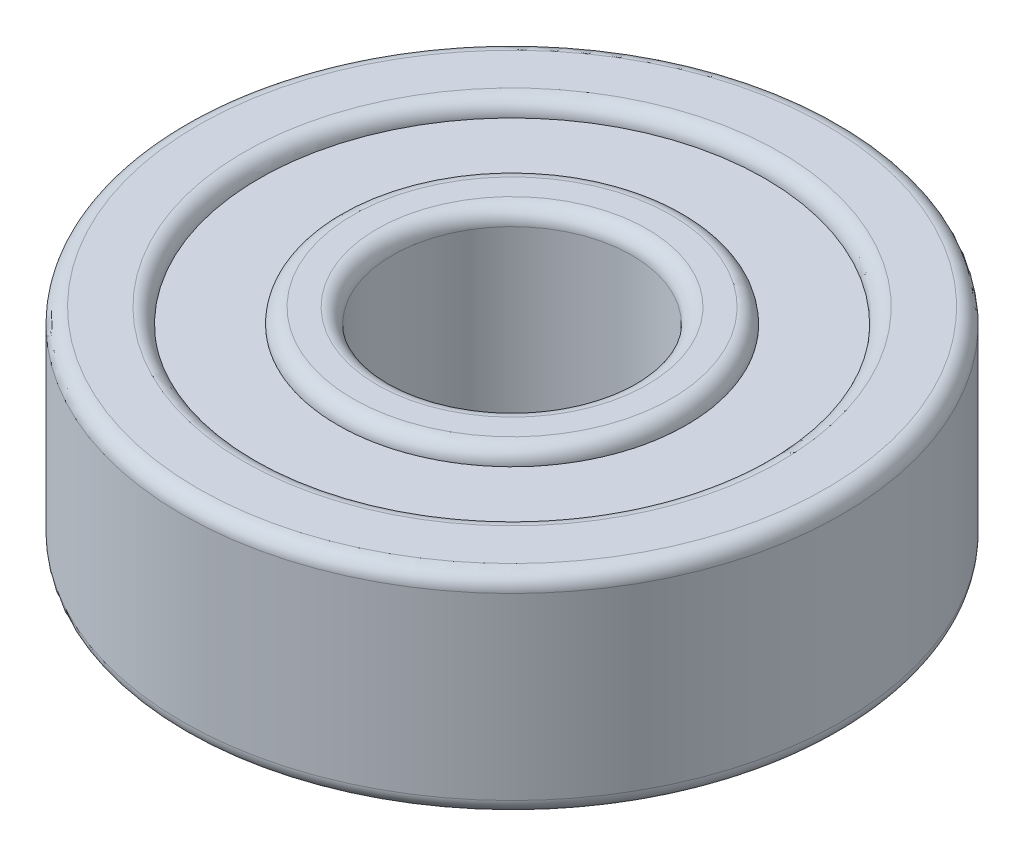
ISO-10303-21;
HEADER;
FILE_DESCRIPTION(('STEP AP214'),'2;1');
FILE_NAME('part.step','',(''),(''),'','','');
FILE_SCHEMA(('AUTOMOTIVE_DESIGN { 1 0 10303 214 1 1 1 1 }'));
ENDSEC;
DATA;
#1=APPLICATION_CONTEXT('core data for automotive mechanical design processes');
#2=APPLICATION_PROTOCOL_DEFINITION('international standard','automotive_design',2000,#1);
#3=PRODUCT_CONTEXT('',#1,'mechanical');
#4=PRODUCT('Part','Part','',(#3));
#5=PRODUCT_RELATED_PRODUCT_CATEGORY('part','',(#4));
#6=PRODUCT_DEFINITION_FORMATION('','',#4);
#7=PRODUCT_DEFINITION_CONTEXT('part definition',#1,'design');
#8=PRODUCT_DEFINITION('design','',#6,#7);
#9=PRODUCT_DEFINITION_SHAPE('','',#8);
#10=(LENGTH_UNIT() NAMED_UNIT(*) SI_UNIT(.MILLI.,.METRE.));
#11=(NAMED_UNIT(*) PLANE_ANGLE_UNIT() SI_UNIT($,.RADIAN.));
#12=(NAMED_UNIT(*) SI_UNIT($,.STERADIAN.) SOLID_ANGLE_UNIT());
#13=UNCERTAINTY_MEASURE_WITH_UNIT(LENGTH_MEASURE(1.E-05),#10,'distance_accuracy_value','');
#14=(GEOMETRIC_REPRESENTATION_CONTEXT(3) GLOBAL_UNCERTAINTY_ASSIGNED_CONTEXT((#13)) GLOBAL_UNIT_ASSIGNED_CONTEXT((#10,
#11,#12)) REPRESENTATION_CONTEXT('',''));
#15=CARTESIAN_POINT('',(0.,0.,0.));
#16=DIRECTION('',(0.,0.,1.));
#17=DIRECTION('',(1.,0.,0.));
#18=AXIS2_PLACEMENT_3D('',#15,#16,#17);
#19=CARTESIAN_POINT('',(0.,-26.8639331784423,0.));
#20=DIRECTION('',(0.,1.,0.));
#21=DIRECTION('',(0.,0.,-1.));
#22=AXIS2_PLACEMENT_3D('',#19,#20,#21);
#23=CYLINDRICAL_SURFACE('',#22,8.4400009);
#24=CARTESIAN_POINT('',(0.,-2.9920057,0.));
#25=DIRECTION('',(0.,-1.,0.));
#26=DIRECTION('',(0.,0.,-1.));
#27=AXIS2_PLACEMENT_3D('',#24,#25,#26);
#28=CIRCLE('',#27,8.4400009);
#29=CARTESIAN_POINT('',(0.,-2.9920057,-8.4400009));
#30=VERTEX_POINT('',#29);
#31=EDGE_CURVE('E49',#30,#30,#28,.F.);
#32=ORIENTED_EDGE('',*,*,#31,.T.);
#33=EDGE_LOOP('',(#32));
#34=FACE_BOUND('',#33,.T.);
#35=CARTESIAN_POINT('',(0.,-2.01495041180427,0.));
#36=DIRECTION('',(0.,-1.,0.));
#37=DIRECTION('',(0.,0.,-1.));
#38=AXIS2_PLACEMENT_3D('',#35,#36,#37);
#39=CIRCLE('',#38,8.4400009);
#40=CARTESIAN_POINT('',(0.,-2.01495041180427,-8.4400009));
#41=VERTEX_POINT('',#40);
#42=EDGE_CURVE('E53',#41,#41,#39,.T.);
#43=ORIENTED_EDGE('',*,*,#42,.T.);
#44=EDGE_LOOP('',(#43));
#45=FACE_BOUND('',#44,.T.);
#46=ADVANCED_FACE('F43',(#34,#45),#23,.T.);
#47=CARTESIAN_POINT('',(0.,-2.01495041180427,0.));
#48=DIRECTION('',(0.,1.,0.));
#49=DIRECTION('',(0.,0.,-1.));
#50=AXIS2_PLACEMENT_3D('',#47,#48,#49);
#51=PLANE('',#50);
#52=CARTESIAN_POINT('',(0.,-2.01495041180427,0.));
#53=DIRECTION('',(0.,-1.,0.));
#54=DIRECTION('',(0.,0.,-1.));
#55=AXIS2_PLACEMENT_3D('',#52,#53,#54);
#56=CIRCLE('',#55,5.8200036);
#57=CARTESIAN_POINT('',(0.,-2.01495041180427,-5.8200036));
#58=VERTEX_POINT('',#57);
#59=EDGE_CURVE('E58',#58,#58,#56,.T.);
#60=ORIENTED_EDGE('',*,*,#59,.T.);
#61=EDGE_LOOP('',(#60));
#62=FACE_BOUND('',#61,.T.);
#63=ORIENTED_EDGE('',*,*,#42,.F.);
#64=EDGE_LOOP('',(#63));
#65=FACE_BOUND('',#64,.T.);
#66=ADVANCED_FACE('F63',(#62,#65),#51,.T.);
#67=CARTESIAN_POINT('',(0.,-26.8639331784423,0.));
#68=DIRECTION('',(0.,1.,0.));
#69=DIRECTION('',(0.,0.,-1.));
#70=AXIS2_PLACEMENT_3D('',#67,#68,#69);
#71=CYLINDRICAL_SURFACE('',#70,5.8200036);
#72=CARTESIAN_POINT('',(0.,-2.9920057,0.));
#73=DIRECTION('',(0.,-1.,0.));
#74=DIRECTION('',(0.,0.,-1.));
#75=AXIS2_PLACEMENT_3D('',#72,#73,#74);
#76=CIRCLE('',#75,5.8200036);
#77=CARTESIAN_POINT('',(0.,-2.9920057,-5.8200036));
#78=VERTEX_POINT('',#77);
#79=EDGE_CURVE('E11',#78,#78,#76,.F.);
#80=ORIENTED_EDGE('',*,*,#79,.F.);
#81=EDGE_LOOP('',(#80));
#82=FACE_BOUND('',#81,.T.);
#83=ORIENTED_EDGE('',*,*,#59,.F.);
#84=EDGE_LOOP('',(#83));
#85=FACE_BOUND('',#84,.T.);
#86=ADVANCED_FACE('F66',(#82,#85),#71,.F.);
#87=CARTESIAN_POINT('',(0.,-2.9920057,0.));
#88=DIRECTION('',(0.,1.,0.));
#89=DIRECTION('',(0.,0.,-1.));
#90=AXIS2_PLACEMENT_3D('',#87,#88,#89);
#91=PLANE('',#90);
#92=ORIENTED_EDGE('',*,*,#31,.F.);
#93=EDGE_LOOP('',(#92));
#94=FACE_BOUND('',#93,.T.);
#95=ORIENTED_EDGE('',*,*,#79,.T.);
#96=EDGE_LOOP('',(#95));
#97=FACE_BOUND('',#96,.T.);
#98=ADVANCED_FACE('F68',(#94,#97),#91,.F.);
#99=CLOSED_SHELL('',(#46,#66,#86,#98));
#100=MANIFOLD_SOLID_BREP('B2',#99);
#101=CARTESIAN_POINT('',(0.,26.8639331784423,0.));
#102=DIRECTION('',(0.,-1.,0.));
#103=DIRECTION('',(0.,0.,-1.));
#104=AXIS2_PLACEMENT_3D('',#101,#102,#103);
#105=CYLINDRICAL_SURFACE('',#104,8.4400009);
#106=CARTESIAN_POINT('',(0.,2.9920057,0.));
#107=DIRECTION('',(0.,-1.,0.));
#108=DIRECTION('',(0.,0.,-1.));
#109=AXIS2_PLACEMENT_3D('',#106,#107,#108);
#110=CIRCLE('',#109,8.4400009);
#111=CARTESIAN_POINT('',(0.,2.9920057,-8.4400009));
#112=VERTEX_POINT('',#111);
#113=EDGE_CURVE('E137',#112,#112,#110,.F.);
#114=ORIENTED_EDGE('',*,*,#113,.F.);
#115=EDGE_LOOP('',(#114));
#116=FACE_BOUND('',#115,.T.);
#117=CARTESIAN_POINT('',(0.,2.01495041180427,0.));
#118=DIRECTION('',(0.,-1.,0.));
#119=DIRECTION('',(0.,0.,-1.));
#120=AXIS2_PLACEMENT_3D('',#117,#118,#119);
#121=CIRCLE('',#120,8.4400009);
#122=CARTESIAN_POINT('',(0.,2.01495041180427,-8.4400009));
#123=VERTEX_POINT('',#122);
#124=EDGE_CURVE('E141',#123,#123,#121,.T.);
#125=ORIENTED_EDGE('',*,*,#124,.F.);
#126=EDGE_LOOP('',(#125));
#127=FACE_BOUND('',#126,.T.);
#128=ADVANCED_FACE('F131',(#116,#127),#105,.T.);
#129=CARTESIAN_POINT('',(0.,2.01495041180427,0.));
#130=DIRECTION('',(0.,-1.,0.));
#131=DIRECTION('',(0.,0.,-1.));
#132=AXIS2_PLACEMENT_3D('',#129,#130,#131);
#133=PLANE('',#132);
#134=CARTESIAN_POINT('',(0.,2.01495041180427,0.));
#135=DIRECTION('',(0.,-1.,0.));
#136=DIRECTION('',(0.,0.,-1.));
#137=AXIS2_PLACEMENT_3D('',#134,#135,#136);
#138=CIRCLE('',#137,5.8200036);
#139=CARTESIAN_POINT('',(0.,2.01495041180427,-5.8200036));
#140=VERTEX_POINT('',#139);
#141=EDGE_CURVE('E146',#140,#140,#138,.T.);
#142=ORIENTED_EDGE('',*,*,#141,.F.);
#143=EDGE_LOOP('',(#142));
#144=FACE_BOUND('',#143,.T.);
#145=ORIENTED_EDGE('',*,*,#124,.T.);
#146=EDGE_LOOP('',(#145));
#147=FACE_BOUND('',#146,.T.);
#148=ADVANCED_FACE('F153',(#144,#147),#133,.T.);
#149=CARTESIAN_POINT('',(0.,26.8639331784423,0.));
#150=DIRECTION('',(0.,-1.,0.));
#151=DIRECTION('',(0.,0.,-1.));
#152=AXIS2_PLACEMENT_3D('',#149,#150,#151);
#153=CYLINDRICAL_SURFACE('',#152,5.8200036);
#154=CARTESIAN_POINT('',(0.,2.9920057,0.));
#155=DIRECTION('',(0.,-1.,0.));
#156=DIRECTION('',(0.,0.,-1.));
#157=AXIS2_PLACEMENT_3D('',#154,#155,#156);
#158=CIRCLE('',#157,5.8200036);
#159=CARTESIAN_POINT('',(0.,2.9920057,-5.8200036));
#160=VERTEX_POINT('',#159);
#161=EDGE_CURVE('E42',#160,#160,#158,.F.);
#162=ORIENTED_EDGE('',*,*,#161,.T.);
#163=EDGE_LOOP('',(#162));
#164=FACE_BOUND('',#163,.T.);
#165=ORIENTED_EDGE('',*,*,#141,.T.);
#166=EDGE_LOOP('',(#165));
#167=FACE_BOUND('',#166,.T.);
#168=ADVANCED_FACE('F151',(#164,#167),#153,.F.);
#169=CARTESIAN_POINT('',(0.,2.9920057,0.));
#170=DIRECTION('',(0.,-1.,0.));
#171=DIRECTION('',(0.,0.,-1.));
#172=AXIS2_PLACEMENT_3D('',#169,#170,#171);
#173=PLANE('',#172);
#174=ORIENTED_EDGE('',*,*,#113,.T.);
#175=EDGE_LOOP('',(#174));
#176=FACE_BOUND('',#175,.T.);
#177=ORIENTED_EDGE('',*,*,#161,.F.);
#178=EDGE_LOOP('',(#177));
#179=FACE_BOUND('',#178,.T.);
#180=ADVANCED_FACE('F172',(#176,#179),#173,.F.);
#181=CLOSED_SHELL('',(#128,#148,#168,#180));
#182=MANIFOLD_SOLID_BREP('B6',#181);
#183=CARTESIAN_POINT('',(5.68391542482456,0.,-4.53277129595592));
#184=DIRECTION('',(0.,1.,0.));
#185=DIRECTION('',(0.781831482468022,0.,-0.623489801858743));
#186=AXIS2_PLACEMENT_3D('',#183,#184,#185);
#187=SPHERICAL_SURFACE('',#186,2.3300055);
#188=CARTESIAN_POINT('',(5.68391542482456,2.3300055,-4.53277129595592));
#189=VERTEX_POINT('',#188);
#190=VERTEX_LOOP('',#189);
#191=FACE_BOUND('',#190,.T.);
#192=ADVANCED_FACE('F198',(#191),#187,.T.);
#193=CLOSED_SHELL('',(#192));
#194=MANIFOLD_SOLID_BREP('B37',#193);
#195=CARTESIAN_POINT('',(7.08772660401141,0.,1.61772734562699));
#196=DIRECTION('',(0.,1.,0.));
#197=DIRECTION('',(0.974927912181826,0.,0.222520933956305));
#198=AXIS2_PLACEMENT_3D('',#195,#196,#197);
#199=SPHERICAL_SURFACE('',#198,2.3300055);
#200=CARTESIAN_POINT('',(7.08772660401141,2.3300055,1.61772734562699));
#201=VERTEX_POINT('',#200);
#202=VERTEX_LOOP('',#201);
#203=FACE_BOUND('',#202,.T.);
#204=ADVANCED_FACE('F231',(#203),#199,.T.);
#205=CLOSED_SHELL('',(#204));
#206=MANIFOLD_SOLID_BREP('B127',#205);
#207=CARTESIAN_POINT('',(3.15433508710332,0.,6.55004430032877));
#208=DIRECTION('',(0.,1.,0.));
#209=DIRECTION('',(0.433883739117565,0.,0.900968867902416));
#210=AXIS2_PLACEMENT_3D('',#207,#208,#209);
#211=SPHERICAL_SURFACE('',#210,2.3300055);
#212=CARTESIAN_POINT('',(3.15433508710332,2.3300055,6.55004430032877));
#213=VERTEX_POINT('',#212);
#214=VERTEX_LOOP('',#213);
#215=FACE_BOUND('',#214,.T.);
#216=ADVANCED_FACE('F264',(#215),#211,.T.);
#217=CLOSED_SHELL('',(#216));
#218=MANIFOLD_SOLID_BREP('B194',#217);
#219=CARTESIAN_POINT('',(-3.15433508710322,0.,6.55004430032881));
#220=DIRECTION('',(0.,1.,0.));
#221=DIRECTION('',(-0.433883739117553,0.,0.900968867902422));
#222=AXIS2_PLACEMENT_3D('',#219,#220,#221);
#223=SPHERICAL_SURFACE('',#222,2.3300055);
#224=CARTESIAN_POINT('',(-3.15433508710322,2.3300055,6.55004430032881));
#225=VERTEX_POINT('',#224);
#226=VERTEX_LOOP('',#225);
#227=FACE_BOUND('',#226,.T.);
#228=ADVANCED_FACE('F297',(#227),#223,.T.);
#229=CLOSED_SHELL('',(#228));
#230=MANIFOLD_SOLID_BREP('B227',#229);
#231=CARTESIAN_POINT('',(-7.08772660401139,0.,1.61772734562709));
#232=DIRECTION('',(0.,1.,0.));
#233=DIRECTION('',(-0.974927912181823,0.,0.222520933956318));
#234=AXIS2_PLACEMENT_3D('',#231,#232,#233);
#235=SPHERICAL_SURFACE('',#234,2.3300055);
#236=CARTESIAN_POINT('',(-7.08772660401139,2.3300055,1.61772734562709));
#237=VERTEX_POINT('',#236);
#238=VERTEX_LOOP('',#237);
#239=FACE_BOUND('',#238,.T.);
#240=ADVANCED_FACE('F330',(#239),#235,.T.);
#241=CLOSED_SHELL('',(#240));
#242=MANIFOLD_SOLID_BREP('B260',#241);
#243=CARTESIAN_POINT('',(-5.68391542482462,0.,-4.53277129595584));
#244=DIRECTION('',(0.,1.,0.));
#245=DIRECTION('',(-0.781831482468031,0.,-0.623489801858732));
#246=AXIS2_PLACEMENT_3D('',#243,#244,#245);
#247=SPHERICAL_SURFACE('',#246,2.3300055);
#248=CARTESIAN_POINT('',(-5.68391542482462,2.3300055,-4.53277129595584));
#249=VERTEX_POINT('',#248);
#250=VERTEX_LOOP('',#249);
#251=FACE_BOUND('',#250,.T.);
#252=ADVANCED_FACE('F363',(#251),#247,.T.);
#253=CLOSED_SHELL('',(#252));
#254=MANIFOLD_SOLID_BREP('B293',#253);
#255=CARTESIAN_POINT('',(0.,0.,-7.2700007));
#256=DIRECTION('',(0.,1.,0.));
#257=DIRECTION('',(0.,0.,-1.));
#258=AXIS2_PLACEMENT_3D('',#255,#256,#257);
#259=SPHERICAL_SURFACE('',#258,2.3300055);
#260=CARTESIAN_POINT('',(0.,2.3300055,-7.2700007));
#261=VERTEX_POINT('',#260);
#262=VERTEX_LOOP('',#261);
#263=FACE_BOUND('',#262,.T.);
#264=ADVANCED_FACE('F398',(#263),#259,.T.);
#265=CLOSED_SHELL('',(#264));
#266=MANIFOLD_SOLID_BREP('B326',#265);
#267=CARTESIAN_POINT('',(0.,-3.5000057,0.));
#268=DIRECTION('',(0.,1.,0.));
#269=DIRECTION('',(0.,0.,1.));
#270=AXIS2_PLACEMENT_3D('',#267,#268,#269);
#271=CYLINDRICAL_SURFACE('',#270,8.4400009);
#272=CARTESIAN_POINT('',(0.,2.9920057,0.));
#273=DIRECTION('',(0.,1.,0.));
#274=DIRECTION('',(0.,0.,1.));
#275=AXIS2_PLACEMENT_3D('',#272,#273,#274);
#276=CIRCLE('',#275,8.4400009);
#277=CARTESIAN_POINT('',(0.,2.9920057,8.4400009));
#278=VERTEX_POINT('',#277);
#279=EDGE_CURVE('E437',#278,#278,#276,.T.);
#280=ORIENTED_EDGE('',*,*,#279,.T.);
#281=EDGE_LOOP('',(#280));
#282=FACE_BOUND('',#281,.T.);
#283=CARTESIAN_POINT('',(0.,2.01495041180427,0.));
#284=DIRECTION('',(0.,-1.,0.));
#285=DIRECTION('',(0.,0.,-1.));
#286=AXIS2_PLACEMENT_3D('',#283,#284,#285);
#287=CIRCLE('',#286,8.4400009);
#288=CARTESIAN_POINT('',(0.,2.01495041180427,-8.4400009));
#289=VERTEX_POINT('',#288);
#290=EDGE_CURVE('E449',#289,#289,#287,.F.);
#291=ORIENTED_EDGE('',*,*,#290,.F.);
#292=EDGE_LOOP('',(#291));
#293=FACE_BOUND('',#292,.T.);
#294=ADVANCED_FACE('F417',(#282,#293),#271,.F.);
#295=CARTESIAN_POINT('',(0.,-2.9920057,0.));
#296=DIRECTION('',(0.,1.,0.));
#297=DIRECTION('',(0.,0.,1.));
#298=AXIS2_PLACEMENT_3D('',#295,#296,#297);
#299=CIRCLE('',#298,8.4400009);
#300=CARTESIAN_POINT('',(0.,-2.9920057,8.4400009));
#301=VERTEX_POINT('',#300);
#302=EDGE_CURVE('E440',#301,#301,#299,.F.);
#303=ORIENTED_EDGE('',*,*,#302,.T.);
#304=EDGE_LOOP('',(#303));
#305=FACE_BOUND('',#304,.T.);
#306=CARTESIAN_POINT('',(0.,-2.01495041180427,0.));
#307=DIRECTION('',(0.,1.,0.));
#308=DIRECTION('',(0.,0.,1.));
#309=AXIS2_PLACEMENT_3D('',#306,#307,#308);
#310=CIRCLE('',#309,8.4400009);
#311=CARTESIAN_POINT('',(0.,-2.01495041180427,8.4400009));
#312=VERTEX_POINT('',#311);
#313=EDGE_CURVE('E452',#312,#312,#310,.F.);
#314=ORIENTED_EDGE('',*,*,#313,.F.);
#315=EDGE_LOOP('',(#314));
#316=FACE_BOUND('',#315,.T.);
#317=ADVANCED_FACE('F459',(#305,#316),#271,.F.);
#318=CARTESIAN_POINT('',(0.,3.5000057,0.));
#319=DIRECTION('',(0.,1.,0.));
#320=DIRECTION('',(0.,0.,1.));
#321=AXIS2_PLACEMENT_3D('',#318,#319,#320);
#322=PLANE('',#321);
#323=CARTESIAN_POINT('',(0.,3.5000057,0.));
#324=DIRECTION('',(0.,1.,0.));
#325=DIRECTION('',(0.,0.,1.));
#326=AXIS2_PLACEMENT_3D('',#323,#324,#325);
#327=CIRCLE('',#326,8.9480009);
#328=CARTESIAN_POINT('',(0.,3.5000057,8.9480009));
#329=VERTEX_POINT('',#328);
#330=EDGE_CURVE('E428',#329,#329,#327,.F.);
#331=ORIENTED_EDGE('',*,*,#330,.T.);
#332=EDGE_LOOP('',(#331));
#333=FACE_BOUND('',#332,.T.);
#334=CARTESIAN_POINT('',(0.,3.5000057,0.));
#335=DIRECTION('',(0.,1.,0.));
#336=DIRECTION('',(0.,0.,1.));
#337=AXIS2_PLACEMENT_3D('',#334,#335,#336);
#338=CIRCLE('',#337,10.4920034);
#339=CARTESIAN_POINT('',(0.,3.5000057,10.4920034));
#340=VERTEX_POINT('',#339);
#341=EDGE_CURVE('E432',#340,#340,#338,.T.);
#342=ORIENTED_EDGE('',*,*,#341,.T.);
#343=EDGE_LOOP('',(#342));
#344=FACE_BOUND('',#343,.T.);
#345=ADVANCED_FACE('F461',(#333,#344),#322,.T.);
#346=CARTESIAN_POINT('',(0.,-3.5000057,0.));
#347=DIRECTION('',(0.,1.,0.));
#348=DIRECTION('',(0.,0.,1.));
#349=AXIS2_PLACEMENT_3D('',#346,#347,#348);
#350=PLANE('',#349);
#351=CARTESIAN_POINT('',(0.,-3.5000057,0.));
#352=DIRECTION('',(0.,1.,0.));
#353=DIRECTION('',(0.,0.,1.));
#354=AXIS2_PLACEMENT_3D('',#351,#352,#353);
#355=CIRCLE('',#354,8.9480009);
#356=CARTESIAN_POINT('',(0.,-3.5000057,8.9480009));
#357=VERTEX_POINT('',#356);
#358=EDGE_CURVE('E443',#357,#357,#355,.T.);
#359=ORIENTED_EDGE('',*,*,#358,.T.);
#360=EDGE_LOOP('',(#359));
#361=FACE_BOUND('',#360,.T.);
#362=CARTESIAN_POINT('',(0.,-3.5000057,0.));
#363=DIRECTION('',(0.,1.,0.));
#364=DIRECTION('',(0.,0.,1.));
#365=AXIS2_PLACEMENT_3D('',#362,#363,#364);
#366=CIRCLE('',#365,10.4920034);
#367=CARTESIAN_POINT('',(0.,-3.5000057,10.4920034));
#368=VERTEX_POINT('',#367);
#369=EDGE_CURVE('E446',#368,#368,#366,.F.);
#370=ORIENTED_EDGE('',*,*,#369,.T.);
#371=EDGE_LOOP('',(#370));
#372=FACE_BOUND('',#371,.T.);
#373=ADVANCED_FACE('F468',(#361,#372),#350,.F.);
#374=CARTESIAN_POINT('',(0.,3.5000057,0.));
#375=DIRECTION('',(0.,-1.,0.));
#376=DIRECTION('',(0.,0.,-1.));
#377=AXIS2_PLACEMENT_3D('',#374,#375,#376);
#378=CYLINDRICAL_SURFACE('',#377,11.0000034);
#379=CARTESIAN_POINT('',(0.,-2.9920057,0.));
#380=DIRECTION('',(0.,1.,0.));
#381=DIRECTION('',(0.,0.,1.));
#382=AXIS2_PLACEMENT_3D('',#379,#380,#381);
#383=CIRCLE('',#382,11.0000034);
#384=CARTESIAN_POINT('',(0.,-2.9920057,11.0000034));
#385=VERTEX_POINT('',#384);
#386=EDGE_CURVE('E397',#385,#385,#383,.T.);
#387=ORIENTED_EDGE('',*,*,#386,.T.);
#388=EDGE_LOOP('',(#387));
#389=FACE_BOUND('',#388,.T.);
#390=CARTESIAN_POINT('',(0.,2.9920057,0.));
#391=DIRECTION('',(0.,1.,0.));
#392=DIRECTION('',(0.,0.,1.));
#393=AXIS2_PLACEMENT_3D('',#390,#391,#392);
#394=CIRCLE('',#393,11.0000034);
#395=CARTESIAN_POINT('',(0.,2.9920057,11.0000034));
#396=VERTEX_POINT('',#395);
#397=EDGE_CURVE('E424',#396,#396,#394,.F.);
#398=ORIENTED_EDGE('',*,*,#397,.T.);
#399=EDGE_LOOP('',(#398));
#400=FACE_BOUND('',#399,.T.);
#401=ADVANCED_FACE('F473',(#389,#400),#378,.T.);
#402=CARTESIAN_POINT('',(0.,0.,0.));
#403=DIRECTION('',(0.,1.,0.));
#404=DIRECTION('',(0.,0.,1.));
#405=AXIS2_PLACEMENT_3D('',#402,#403,#404);
#406=TOROIDAL_SURFACE('',#405,7.2700007,2.3300055);
#407=ORIENTED_EDGE('',*,*,#313,.T.);
#408=EDGE_LOOP('',(#407));
#409=FACE_BOUND('',#408,.T.);
#410=ORIENTED_EDGE('',*,*,#290,.T.);
#411=EDGE_LOOP('',(#410));
#412=FACE_BOUND('',#411,.T.);
#413=ADVANCED_FACE('F456',(#409,#412),#406,.F.);
#414=CARTESIAN_POINT('',(0.,-2.9920057,0.));
#415=DIRECTION('',(0.,1.,0.));
#416=DIRECTION('',(0.,0.,1.));
#417=AXIS2_PLACEMENT_3D('',#414,#415,#416);
#418=TOROIDAL_SURFACE('',#417,8.9480009,0.508);
#419=ORIENTED_EDGE('',*,*,#302,.F.);
#420=EDGE_LOOP('',(#419));
#421=FACE_BOUND('',#420,.T.);
#422=ORIENTED_EDGE('',*,*,#358,.F.);
#423=EDGE_LOOP('',(#422));
#424=FACE_BOUND('',#423,.T.);
#425=ADVANCED_FACE('F479',(#421,#424),#418,.T.);
#426=CARTESIAN_POINT('',(0.,2.9920057,0.));
#427=DIRECTION('',(0.,1.,0.));
#428=DIRECTION('',(0.,0.,1.));
#429=AXIS2_PLACEMENT_3D('',#426,#427,#428);
#430=TOROIDAL_SURFACE('',#429,8.9480009,0.508);
#431=ORIENTED_EDGE('',*,*,#330,.F.);
#432=EDGE_LOOP('',(#431));
#433=FACE_BOUND('',#432,.T.);
#434=ORIENTED_EDGE('',*,*,#279,.F.);
#435=EDGE_LOOP('',(#434));
#436=FACE_BOUND('',#435,.T.);
#437=ADVANCED_FACE('F482',(#433,#436),#430,.T.);
#438=CARTESIAN_POINT('',(0.,-2.9920057,0.));
#439=DIRECTION('',(0.,1.,0.));
#440=DIRECTION('',(0.,0.,1.));
#441=AXIS2_PLACEMENT_3D('',#438,#439,#440);
#442=TOROIDAL_SURFACE('',#441,10.4920034,0.508);
#443=ORIENTED_EDGE('',*,*,#369,.F.);
#444=EDGE_LOOP('',(#443));
#445=FACE_BOUND('',#444,.T.);
#446=ORIENTED_EDGE('',*,*,#386,.F.);
#447=EDGE_LOOP('',(#446));
#448=FACE_BOUND('',#447,.T.);
#449=ADVANCED_FACE('F485',(#445,#448),#442,.T.);
#450=CARTESIAN_POINT('',(0.,2.9920057,0.));
#451=DIRECTION('',(0.,1.,0.));
#452=DIRECTION('',(0.,0.,1.));
#453=AXIS2_PLACEMENT_3D('',#450,#451,#452);
#454=TOROIDAL_SURFACE('',#453,10.4920034,0.508);
#455=ORIENTED_EDGE('',*,*,#397,.F.);
#456=EDGE_LOOP('',(#455));
#457=FACE_BOUND('',#456,.T.);
#458=ORIENTED_EDGE('',*,*,#341,.F.);
#459=EDGE_LOOP('',(#458));
#460=FACE_BOUND('',#459,.T.);
#461=ADVANCED_FACE('F419',(#457,#460),#454,.T.);
#462=CLOSED_SHELL('',(#294,#317,#345,#373,#401,#413,#425,#437,#449,#461));
#463=MANIFOLD_SOLID_BREP('B359',#462);
#464=CARTESIAN_POINT('',(0.,-3.5000057,0.));
#465=DIRECTION('',(0.,1.,0.));
#466=DIRECTION('',(0.,0.,1.));
#467=AXIS2_PLACEMENT_3D('',#464,#465,#466);
#468=CYLINDRICAL_SURFACE('',#467,5.8200036);
#469=CARTESIAN_POINT('',(0.,2.9920057,0.));
#470=DIRECTION('',(0.,1.,0.));
#471=DIRECTION('',(0.,0.,1.));
#472=AXIS2_PLACEMENT_3D('',#469,#470,#471);
#473=CIRCLE('',#472,5.8200036);
#474=CARTESIAN_POINT('',(0.,2.9920057,5.8200036));
#475=VERTEX_POINT('',#474);
#476=EDGE_CURVE('E416',#475,#475,#473,.F.);
#477=ORIENTED_EDGE('',*,*,#476,.T.);
#478=EDGE_LOOP('',(#477));
#479=FACE_BOUND('',#478,.T.);
#480=CARTESIAN_POINT('',(0.,1.8238514303588,0.));
#481=DIRECTION('',(0.,-1.,0.));
#482=DIRECTION('',(0.,0.,-1.));
#483=AXIS2_PLACEMENT_3D('',#480,#481,#482);
#484=CIRCLE('',#483,5.8200036);
#485=CARTESIAN_POINT('',(0.,1.8238514303588,-5.8200036));
#486=VERTEX_POINT('',#485);
#487=EDGE_CURVE('E599',#486,#486,#484,.F.);
#488=ORIENTED_EDGE('',*,*,#487,.T.);
#489=EDGE_LOOP('',(#488));
#490=FACE_BOUND('',#489,.T.);
#491=ADVANCED_FACE('F567',(#479,#490),#468,.T.);
#492=CARTESIAN_POINT('',(0.,-2.9920057,0.));
#493=DIRECTION('',(0.,1.,0.));
#494=DIRECTION('',(0.,0.,1.));
#495=AXIS2_PLACEMENT_3D('',#492,#493,#494);
#496=CIRCLE('',#495,5.8200036);
#497=CARTESIAN_POINT('',(0.,-2.9920057,5.8200036));
#498=VERTEX_POINT('',#497);
#499=EDGE_CURVE('E582',#498,#498,#496,.T.);
#500=ORIENTED_EDGE('',*,*,#499,.T.);
#501=EDGE_LOOP('',(#500));
#502=FACE_BOUND('',#501,.T.);
#503=CARTESIAN_POINT('',(0.,-1.8238514303588,0.));
#504=DIRECTION('',(0.,1.,0.));
#505=DIRECTION('',(0.,0.,1.));
#506=AXIS2_PLACEMENT_3D('',#503,#504,#505);
#507=CIRCLE('',#506,5.8200036);
#508=CARTESIAN_POINT('',(0.,-1.8238514303588,5.8200036));
#509=VERTEX_POINT('',#508);
#510=EDGE_CURVE('E602',#509,#509,#507,.F.);
#511=ORIENTED_EDGE('',*,*,#510,.T.);
#512=EDGE_LOOP('',(#511));
#513=FACE_BOUND('',#512,.T.);
#514=ADVANCED_FACE('F606',(#502,#513),#468,.T.);
#515=CARTESIAN_POINT('',(0.,3.5000057,0.));
#516=DIRECTION('',(0.,1.,0.));
#517=DIRECTION('',(0.,0.,1.));
#518=AXIS2_PLACEMENT_3D('',#515,#516,#517);
#519=PLANE('',#518);
#520=CARTESIAN_POINT('',(0.,3.5000057,0.));
#521=DIRECTION('',(0.,1.,0.));
#522=DIRECTION('',(0.,0.,1.));
#523=AXIS2_PLACEMENT_3D('',#520,#521,#522);
#524=CIRCLE('',#523,4.5080047);
#525=CARTESIAN_POINT('',(0.,3.5000057,4.5080047));
#526=VERTEX_POINT('',#525);
#527=EDGE_CURVE('E574',#526,#526,#524,.F.);
#528=ORIENTED_EDGE('',*,*,#527,.T.);
#529=EDGE_LOOP('',(#528));
#530=FACE_BOUND('',#529,.T.);
#531=CARTESIAN_POINT('',(0.,3.5000057,0.));
#532=DIRECTION('',(0.,1.,0.));
#533=DIRECTION('',(0.,0.,1.));
#534=AXIS2_PLACEMENT_3D('',#531,#532,#533);
#535=CIRCLE('',#534,5.3120036);
#536=CARTESIAN_POINT('',(0.,3.5000057,5.3120036));
#537=VERTEX_POINT('',#536);
#538=EDGE_CURVE('E578',#537,#537,#535,.T.);
#539=ORIENTED_EDGE('',*,*,#538,.T.);
#540=EDGE_LOOP('',(#539));
#541=FACE_BOUND('',#540,.T.);
#542=ADVANCED_FACE('F630',(#530,#541),#519,.T.);
#543=CARTESIAN_POINT('',(0.,3.5000057,0.));
#544=DIRECTION('',(0.,-1.,0.));
#545=DIRECTION('',(0.,0.,-1.));
#546=AXIS2_PLACEMENT_3D('',#543,#544,#545);
#547=CYLINDRICAL_SURFACE('',#546,4.0000047);
#548=CARTESIAN_POINT('',(0.,-2.9920057,0.));
#549=DIRECTION('',(0.,1.,0.));
#550=DIRECTION('',(0.,0.,1.));
#551=AXIS2_PLACEMENT_3D('',#548,#549,#550);
#552=CIRCLE('',#551,4.0000047);
#553=CARTESIAN_POINT('',(0.,-2.9920057,4.0000047));
#554=VERTEX_POINT('',#553);
#555=EDGE_CURVE('E587',#554,#554,#552,.F.);
#556=ORIENTED_EDGE('',*,*,#555,.T.);
#557=EDGE_LOOP('',(#556));
#558=FACE_BOUND('',#557,.T.);
#559=CARTESIAN_POINT('',(0.,2.9920057,0.));
#560=DIRECTION('',(0.,1.,0.));
#561=DIRECTION('',(0.,0.,1.));
#562=AXIS2_PLACEMENT_3D('',#559,#560,#561);
#563=CIRCLE('',#562,4.0000047);
#564=CARTESIAN_POINT('',(0.,2.9920057,4.0000047));
#565=VERTEX_POINT('',#564);
#566=EDGE_CURVE('E590',#565,#565,#563,.T.);
#567=ORIENTED_EDGE('',*,*,#566,.T.);
#568=EDGE_LOOP('',(#567));
#569=FACE_BOUND('',#568,.T.);
#570=ADVANCED_FACE('F621',(#558,#569),#547,.F.);
#571=CARTESIAN_POINT('',(0.,-3.5000057,0.));
#572=DIRECTION('',(0.,1.,0.));
#573=DIRECTION('',(0.,0.,1.));
#574=AXIS2_PLACEMENT_3D('',#571,#572,#573);
#575=PLANE('',#574);
#576=CARTESIAN_POINT('',(0.,-3.5000057,0.));
#577=DIRECTION('',(0.,1.,0.));
#578=DIRECTION('',(0.,0.,1.));
#579=AXIS2_PLACEMENT_3D('',#576,#577,#578);
#580=CIRCLE('',#579,4.5080047);
#581=CARTESIAN_POINT('',(0.,-3.5000057,4.5080047));
#582=VERTEX_POINT('',#581);
#583=EDGE_CURVE('E593',#582,#582,#580,.T.);
#584=ORIENTED_EDGE('',*,*,#583,.T.);
#585=EDGE_LOOP('',(#584));
#586=FACE_BOUND('',#585,.T.);
#587=CARTESIAN_POINT('',(0.,-3.5000057,0.));
#588=DIRECTION('',(0.,1.,0.));
#589=DIRECTION('',(0.,0.,1.));
#590=AXIS2_PLACEMENT_3D('',#587,#588,#589);
#591=CIRCLE('',#590,5.3120036);
#592=CARTESIAN_POINT('',(0.,-3.5000057,5.3120036));
#593=VERTEX_POINT('',#592);
#594=EDGE_CURVE('E596',#593,#593,#591,.F.);
#595=ORIENTED_EDGE('',*,*,#594,.T.);
#596=EDGE_LOOP('',(#595));
#597=FACE_BOUND('',#596,.T.);
#598=ADVANCED_FACE('F611',(#586,#597),#575,.F.);
#599=CARTESIAN_POINT('',(0.,0.,0.));
#600=DIRECTION('',(0.,1.,0.));
#601=DIRECTION('',(0.,0.,1.));
#602=AXIS2_PLACEMENT_3D('',#599,#600,#601);
#603=TOROIDAL_SURFACE('',#602,7.2700007,2.3300055);
#604=ORIENTED_EDGE('',*,*,#487,.F.);
#605=EDGE_LOOP('',(#604));
#606=FACE_BOUND('',#605,.T.);
#607=ORIENTED_EDGE('',*,*,#510,.F.);
#608=EDGE_LOOP('',(#607));
#609=FACE_BOUND('',#608,.T.);
#610=ADVANCED_FACE('F608',(#606,#609),#603,.F.);
#611=CARTESIAN_POINT('',(0.,-2.9920057,0.));
#612=DIRECTION('',(0.,1.,0.));
#613=DIRECTION('',(0.,0.,1.));
#614=AXIS2_PLACEMENT_3D('',#611,#612,#613);
#615=TOROIDAL_SURFACE('',#614,4.5080047,0.508);
#616=ORIENTED_EDGE('',*,*,#555,.F.);
#617=EDGE_LOOP('',(#616));
#618=FACE_BOUND('',#617,.T.);
#619=ORIENTED_EDGE('',*,*,#583,.F.);
#620=EDGE_LOOP('',(#619));
#621=FACE_BOUND('',#620,.T.);
#622=ADVANCED_FACE('F610',(#618,#621),#615,.T.);
#623=CARTESIAN_POINT('',(0.,-2.9920057,0.));
#624=DIRECTION('',(0.,1.,0.));
#625=DIRECTION('',(0.,0.,1.));
#626=AXIS2_PLACEMENT_3D('',#623,#624,#625);
#627=TOROIDAL_SURFACE('',#626,5.3120036,0.508);
#628=ORIENTED_EDGE('',*,*,#594,.F.);
#629=EDGE_LOOP('',(#628));
#630=FACE_BOUND('',#629,.T.);
#631=ORIENTED_EDGE('',*,*,#499,.F.);
#632=EDGE_LOOP('',(#631));
#633=FACE_BOUND('',#632,.T.);
#634=ADVANCED_FACE('F618',(#630,#633),#627,.T.);
#635=CARTESIAN_POINT('',(0.,2.9920057,0.));
#636=DIRECTION('',(0.,1.,0.));
#637=DIRECTION('',(0.,0.,1.));
#638=AXIS2_PLACEMENT_3D('',#635,#636,#637);
#639=TOROIDAL_SURFACE('',#638,4.5080047,0.508);
#640=ORIENTED_EDGE('',*,*,#527,.F.);
#641=EDGE_LOOP('',(#640));
#642=FACE_BOUND('',#641,.T.);
#643=ORIENTED_EDGE('',*,*,#566,.F.);
#644=EDGE_LOOP('',(#643));
#645=FACE_BOUND('',#644,.T.);
#646=ADVANCED_FACE('F640',(#642,#645),#639,.T.);
#647=CARTESIAN_POINT('',(0.,2.9920057,0.));
#648=DIRECTION('',(0.,1.,0.));
#649=DIRECTION('',(0.,0.,1.));
#650=AXIS2_PLACEMENT_3D('',#647,#648,#649);
#651=TOROIDAL_SURFACE('',#650,5.3120036,0.508);
#652=ORIENTED_EDGE('',*,*,#476,.F.);
#653=EDGE_LOOP('',(#652));
#654=FACE_BOUND('',#653,.T.);
#655=ORIENTED_EDGE('',*,*,#538,.F.);
#656=EDGE_LOOP('',(#655));
#657=FACE_BOUND('',#656,.T.);
#658=ADVANCED_FACE('F569',(#654,#657),#651,.T.);
#659=CLOSED_SHELL('',(#491,#514,#542,#570,#598,#610,#622,#634,#646,#658));
#660=MANIFOLD_SOLID_BREP('B392',#659);
#661=ADVANCED_BREP_SHAPE_REPRESENTATION('',(#18,#100,#182,#194,#206,#218,#230,#242,#254,#266,
#463,#660),#14);
#662=SHAPE_DEFINITION_REPRESENTATION(#9,#661);
ENDSEC;
END-ISO-10303-21;
